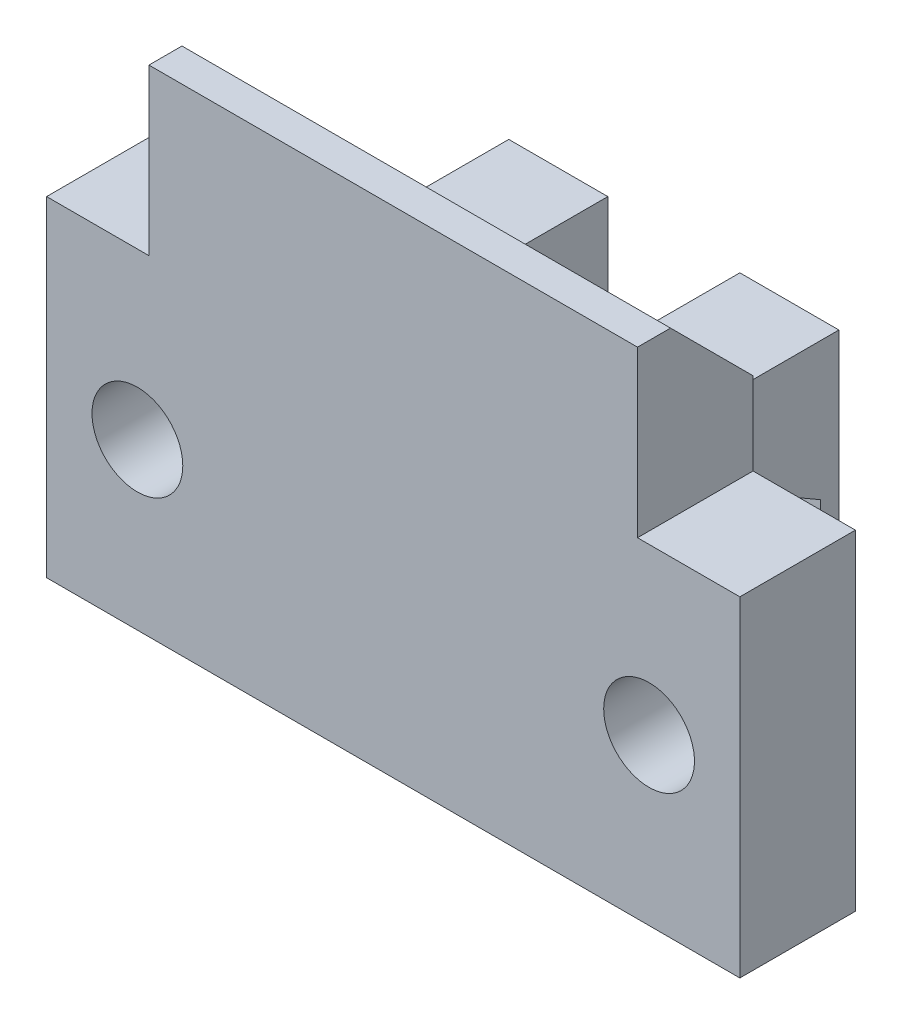
ISO-10303-21;
HEADER;
FILE_DESCRIPTION(('STEP AP214'),'2;1');
FILE_NAME('part.step','',(''),(''),'','','');
FILE_SCHEMA(('AUTOMOTIVE_DESIGN { 1 0 10303 214 1 1 1 1 }'));
ENDSEC;
DATA;
#1=APPLICATION_CONTEXT('core data for automotive mechanical design processes');
#2=APPLICATION_PROTOCOL_DEFINITION('international standard','automotive_design',2000,#1);
#3=PRODUCT_CONTEXT('',#1,'mechanical');
#4=PRODUCT('Part','Part','',(#3));
#5=PRODUCT_RELATED_PRODUCT_CATEGORY('part','',(#4));
#6=PRODUCT_DEFINITION_FORMATION('','',#4);
#7=PRODUCT_DEFINITION_CONTEXT('part definition',#1,'design');
#8=PRODUCT_DEFINITION('design','',#6,#7);
#9=PRODUCT_DEFINITION_SHAPE('','',#8);
#10=(LENGTH_UNIT() NAMED_UNIT(*) SI_UNIT(.MILLI.,.METRE.));
#11=(NAMED_UNIT(*) PLANE_ANGLE_UNIT() SI_UNIT($,.RADIAN.));
#12=(NAMED_UNIT(*) SI_UNIT($,.STERADIAN.) SOLID_ANGLE_UNIT());
#13=UNCERTAINTY_MEASURE_WITH_UNIT(LENGTH_MEASURE(1.E-05),#10,'distance_accuracy_value','');
#14=(GEOMETRIC_REPRESENTATION_CONTEXT(3) GLOBAL_UNCERTAINTY_ASSIGNED_CONTEXT((#13)) GLOBAL_UNIT_ASSIGNED_CONTEXT((#10,
#11,#12)) REPRESENTATION_CONTEXT('',''));
#15=CARTESIAN_POINT('',(0.,0.,0.));
#16=DIRECTION('',(0.,0.,1.));
#17=DIRECTION('',(1.,0.,0.));
#18=AXIS2_PLACEMENT_3D('',#15,#16,#17);
#19=CARTESIAN_POINT('',(-21.001,10.,-9.49999999999999));
#20=DIRECTION('',(1.,0.,0.));
#21=DIRECTION('',(0.,0.,-1.));
#22=AXIS2_PLACEMENT_3D('',#19,#20,#21);
#23=CYLINDRICAL_SURFACE('',#22,1.75);
#24=CARTESIAN_POINT('',(4.,10.,-9.49999999999999));
#25=DIRECTION('',(-1.,0.,0.));
#26=DIRECTION('',(0.,0.,1.));
#27=AXIS2_PLACEMENT_3D('',#24,#25,#26);
#28=CIRCLE('',#27,1.75);
#29=CARTESIAN_POINT('',(4.,10.,-7.74999999999999));
#30=VERTEX_POINT('',#29);
#31=EDGE_CURVE('E313',#30,#30,#28,.F.);
#32=ORIENTED_EDGE('',*,*,#31,.F.);
#33=EDGE_LOOP('',(#32));
#34=FACE_BOUND('',#33,.T.);
#35=CARTESIAN_POINT('',(7.,10.,-9.49999999999999));
#36=DIRECTION('',(1.,0.,0.));
#37=DIRECTION('',(0.,0.,-1.));
#38=AXIS2_PLACEMENT_3D('',#35,#36,#37);
#39=CIRCLE('',#38,1.75);
#40=CARTESIAN_POINT('',(7.,10.,-11.25));
#41=VERTEX_POINT('',#40);
#42=EDGE_CURVE('E261',#41,#41,#39,.F.);
#43=ORIENTED_EDGE('',*,*,#42,.F.);
#44=EDGE_LOOP('',(#43));
#45=FACE_BOUND('',#44,.T.);
#46=ADVANCED_FACE('F47',(#34,#45),#23,.F.);
#47=CARTESIAN_POINT('',(21.001,10.,-9.49999999999999));
#48=DIRECTION('',(-1.,0.,0.));
#49=DIRECTION('',(0.,0.,1.));
#50=AXIS2_PLACEMENT_3D('',#47,#48,#49);
#51=CYLINDRICAL_SURFACE('',#50,1.75);
#52=CARTESIAN_POINT('',(-4.,10.,-9.49999999999999));
#53=DIRECTION('',(-1.,0.,0.));
#54=DIRECTION('',(0.,0.,1.));
#55=AXIS2_PLACEMENT_3D('',#52,#53,#54);
#56=CIRCLE('',#55,1.75);
#57=CARTESIAN_POINT('',(-4.,10.,-7.74999999999999));
#58=VERTEX_POINT('',#57);
#59=EDGE_CURVE('E283',#58,#58,#56,.F.);
#60=ORIENTED_EDGE('',*,*,#59,.T.);
#61=EDGE_LOOP('',(#60));
#62=FACE_BOUND('',#61,.T.);
#63=CARTESIAN_POINT('',(-7.,10.,-9.49999999999999));
#64=DIRECTION('',(-1.,0.,0.));
#65=DIRECTION('',(0.,0.,1.));
#66=AXIS2_PLACEMENT_3D('',#63,#64,#65);
#67=CIRCLE('',#66,1.75);
#68=CARTESIAN_POINT('',(-7.,10.,-7.74999999999999));
#69=VERTEX_POINT('',#68);
#70=EDGE_CURVE('E272',#69,#69,#67,.F.);
#71=ORIENTED_EDGE('',*,*,#70,.F.);
#72=EDGE_LOOP('',(#71));
#73=FACE_BOUND('',#72,.T.);
#74=ADVANCED_FACE('F497',(#62,#73),#51,.F.);
#75=CARTESIAN_POINT('',(0.,20.,0.));
#76=DIRECTION('',(0.,1.,0.));
#77=DIRECTION('',(0.,0.,1.));
#78=AXIS2_PLACEMENT_3D('',#75,#76,#77);
#79=PLANE('',#78);
#80=DIRECTION('',(-1.,0.,0.));
#81=VECTOR('',#80,1.);
#82=CARTESIAN_POINT('',(-14.8,20.,-3.5));
#83=LINE('',#82,#81);
#84=CARTESIAN_POINT('',(10.,20.,-3.5));
#85=VERTEX_POINT('',#84);
#86=CARTESIAN_POINT('',(4.,20.,-3.5));
#87=VERTEX_POINT('',#86);
#88=EDGE_CURVE('E305',#85,#87,#83,.T.);
#89=ORIENTED_EDGE('',*,*,#88,.F.);
#90=DIRECTION('',(0.,0.,-1.));
#91=VECTOR('',#90,1.);
#92=CARTESIAN_POINT('',(10.,20.,-3.49999999999999));
#93=LINE('',#92,#91);
#94=CARTESIAN_POINT('',(10.,20.,-13.5));
#95=VERTEX_POINT('',#94);
#96=EDGE_CURVE('E416',#85,#95,#93,.T.);
#97=ORIENTED_EDGE('',*,*,#96,.T.);
#98=DIRECTION('',(-1.,0.,0.));
#99=VECTOR('',#98,1.);
#100=CARTESIAN_POINT('',(10.,20.,-13.5));
#101=LINE('',#100,#99);
#102=CARTESIAN_POINT('',(4.,20.,-13.5));
#103=VERTEX_POINT('',#102);
#104=EDGE_CURVE('E412',#95,#103,#101,.T.);
#105=ORIENTED_EDGE('',*,*,#104,.T.);
#106=DIRECTION('',(0.,0.,-1.));
#107=VECTOR('',#106,1.);
#108=CARTESIAN_POINT('',(4.,20.,-3.49999999999999));
#109=LINE('',#108,#107);
#110=EDGE_CURVE('E408',#87,#103,#109,.T.);
#111=ORIENTED_EDGE('',*,*,#110,.F.);
#112=EDGE_LOOP('',(#89,#97,#105,#111));
#113=FACE_BOUND('',#112,.T.);
#114=ADVANCED_FACE('F503',(#113),#79,.T.);
#115=DIRECTION('',(-1.,0.,0.));
#116=VECTOR('',#115,1.);
#117=CARTESIAN_POINT('',(0.,20.,-3.5));
#118=LINE('',#117,#116);
#119=CARTESIAN_POINT('',(21.,20.,-3.5));
#120=VERTEX_POINT('',#119);
#121=CARTESIAN_POINT('',(14.8,20.,-3.5));
#122=VERTEX_POINT('',#121);
#123=EDGE_CURVE('E350',#120,#122,#118,.T.);
#124=ORIENTED_EDGE('',*,*,#123,.T.);
#125=DIRECTION('',(0.,0.,1.));
#126=VECTOR('',#125,1.);
#127=CARTESIAN_POINT('',(14.8,20.,-34.7435593362856));
#128=LINE('',#127,#126);
#129=CARTESIAN_POINT('',(14.8,20.,3.5));
#130=VERTEX_POINT('',#129);
#131=EDGE_CURVE('E300',#122,#130,#128,.T.);
#132=ORIENTED_EDGE('',*,*,#131,.T.);
#133=DIRECTION('',(-1.,0.,0.));
#134=VECTOR('',#133,1.);
#135=CARTESIAN_POINT('',(0.,20.,3.5));
#136=LINE('',#135,#134);
#137=CARTESIAN_POINT('',(21.,20.,3.5));
#138=VERTEX_POINT('',#137);
#139=EDGE_CURVE('E345',#138,#130,#136,.T.);
#140=ORIENTED_EDGE('',*,*,#139,.F.);
#141=DIRECTION('',(0.,0.,-1.));
#142=VECTOR('',#141,1.);
#143=CARTESIAN_POINT('',(21.,20.,0.));
#144=LINE('',#143,#142);
#145=EDGE_CURVE('E348',#138,#120,#144,.T.);
#146=ORIENTED_EDGE('',*,*,#145,.T.);
#147=EDGE_LOOP('',(#124,#132,#140,#146));
#148=FACE_BOUND('',#147,.T.);
#149=ADVANCED_FACE('F480',(#148),#79,.T.);
#150=CARTESIAN_POINT('',(-4.,20.,-3.5));
#151=VERTEX_POINT('',#150);
#152=CARTESIAN_POINT('',(-10.,20.,-3.5));
#153=VERTEX_POINT('',#152);
#154=EDGE_CURVE('E310',#151,#153,#83,.T.);
#155=ORIENTED_EDGE('',*,*,#154,.F.);
#156=DIRECTION('',(0.,0.,-1.));
#157=VECTOR('',#156,1.);
#158=CARTESIAN_POINT('',(-4.,20.,0.));
#159=LINE('',#158,#157);
#160=CARTESIAN_POINT('',(-4.,20.,-13.5));
#161=VERTEX_POINT('',#160);
#162=EDGE_CURVE('E353',#151,#161,#159,.T.);
#163=ORIENTED_EDGE('',*,*,#162,.T.);
#164=DIRECTION('',(1.,0.,0.));
#165=VECTOR('',#164,1.);
#166=CARTESIAN_POINT('',(0.,20.,-13.5));
#167=LINE('',#166,#165);
#168=CARTESIAN_POINT('',(-10.,20.,-13.5));
#169=VERTEX_POINT('',#168);
#170=EDGE_CURVE('E356',#169,#161,#167,.T.);
#171=ORIENTED_EDGE('',*,*,#170,.F.);
#172=DIRECTION('',(0.,0.,-1.));
#173=VECTOR('',#172,1.);
#174=CARTESIAN_POINT('',(-10.,20.,0.));
#175=LINE('',#174,#173);
#176=EDGE_CURVE('E359',#153,#169,#175,.T.);
#177=ORIENTED_EDGE('',*,*,#176,.F.);
#178=EDGE_LOOP('',(#155,#163,#171,#177));
#179=FACE_BOUND('',#178,.T.);
#180=ADVANCED_FACE('F535',(#179),#79,.T.);
#181=CARTESIAN_POINT('',(-15.5,10.,3.5));
#182=DIRECTION('',(0.,0.,-1.));
#183=DIRECTION('',(-1.,0.,0.));
#184=AXIS2_PLACEMENT_3D('',#181,#182,#183);
#185=CYLINDRICAL_SURFACE('',#184,2.75);
#186=CARTESIAN_POINT('',(-15.5,10.,3.5));
#187=DIRECTION('',(0.,0.,-1.));
#188=DIRECTION('',(1.,0.,0.));
#189=AXIS2_PLACEMENT_3D('',#186,#187,#188);
#190=CIRCLE('',#189,2.75);
#191=CARTESIAN_POINT('',(-12.75,10.,3.5));
#192=VERTEX_POINT('',#191);
#193=EDGE_CURVE('E335',#192,#192,#190,.T.);
#194=ORIENTED_EDGE('',*,*,#193,.F.);
#195=EDGE_LOOP('',(#194));
#196=FACE_BOUND('',#195,.T.);
#197=CARTESIAN_POINT('',(-15.5,10.,-1.5));
#198=DIRECTION('',(0.,0.,-1.));
#199=DIRECTION('',(-1.,0.,0.));
#200=AXIS2_PLACEMENT_3D('',#197,#198,#199);
#201=CIRCLE('',#200,2.75);
#202=CARTESIAN_POINT('',(-18.25,10.,-1.5));
#203=VERTEX_POINT('',#202);
#204=EDGE_CURVE('E339',#203,#203,#201,.F.);
#205=ORIENTED_EDGE('',*,*,#204,.F.);
#206=EDGE_LOOP('',(#205));
#207=FACE_BOUND('',#206,.T.);
#208=ADVANCED_FACE('F530',(#196,#207),#185,.F.);
#209=CARTESIAN_POINT('',(15.5,10.,3.5));
#210=DIRECTION('',(0.,0.,-1.));
#211=DIRECTION('',(-1.,0.,0.));
#212=AXIS2_PLACEMENT_3D('',#209,#210,#211);
#213=CYLINDRICAL_SURFACE('',#212,2.75);
#214=CARTESIAN_POINT('',(15.5,10.,3.5));
#215=DIRECTION('',(0.,0.,-1.));
#216=DIRECTION('',(-1.,0.,0.));
#217=AXIS2_PLACEMENT_3D('',#214,#215,#216);
#218=CIRCLE('',#217,2.75);
#219=CARTESIAN_POINT('',(12.75,10.,3.5));
#220=VERTEX_POINT('',#219);
#221=EDGE_CURVE('E331',#220,#220,#218,.T.);
#222=ORIENTED_EDGE('',*,*,#221,.F.);
#223=EDGE_LOOP('',(#222));
#224=FACE_BOUND('',#223,.T.);
#225=CARTESIAN_POINT('',(15.5,10.,-1.5));
#226=DIRECTION('',(0.,0.,-1.));
#227=DIRECTION('',(-1.,0.,0.));
#228=AXIS2_PLACEMENT_3D('',#225,#226,#227);
#229=CIRCLE('',#228,2.75);
#230=CARTESIAN_POINT('',(12.75,10.,-1.5));
#231=VERTEX_POINT('',#230);
#232=EDGE_CURVE('E320',#231,#231,#229,.F.);
#233=ORIENTED_EDGE('',*,*,#232,.F.);
#234=EDGE_LOOP('',(#233));
#235=FACE_BOUND('',#234,.T.);
#236=ADVANCED_FACE('F527',(#224,#235),#213,.F.);
#237=CARTESIAN_POINT('',(-21.,20.,0.));
#238=DIRECTION('',(-1.,0.,0.));
#239=DIRECTION('',(0.,0.,1.));
#240=AXIS2_PLACEMENT_3D('',#237,#238,#239);
#241=PLANE('',#240);
#242=DIRECTION('',(0.,0.,-1.));
#243=VECTOR('',#242,1.);
#244=CARTESIAN_POINT('',(-21.,0.,0.));
#245=LINE('',#244,#243);
#246=CARTESIAN_POINT('',(-21.,0.,3.5));
#247=VERTEX_POINT('',#246);
#248=CARTESIAN_POINT('',(-21.,0.,-3.5));
#249=VERTEX_POINT('',#248);
#250=EDGE_CURVE('E363',#247,#249,#245,.T.);
#251=ORIENTED_EDGE('',*,*,#250,.F.);
#252=DIRECTION('',(0.,-1.,0.));
#253=VECTOR('',#252,1.);
#254=CARTESIAN_POINT('',(-21.,20.,3.5));
#255=LINE('',#254,#253);
#256=CARTESIAN_POINT('',(-21.,20.,3.5));
#257=VERTEX_POINT('',#256);
#258=EDGE_CURVE('E402',#257,#247,#255,.T.);
#259=ORIENTED_EDGE('',*,*,#258,.F.);
#260=DIRECTION('',(0.,0.,-1.));
#261=VECTOR('',#260,1.);
#262=CARTESIAN_POINT('',(-21.,20.,0.));
#263=LINE('',#262,#261);
#264=CARTESIAN_POINT('',(-21.,20.,-3.5));
#265=VERTEX_POINT('',#264);
#266=EDGE_CURVE('E340',#257,#265,#263,.T.);
#267=ORIENTED_EDGE('',*,*,#266,.T.);
#268=DIRECTION('',(0.,-1.,0.));
#269=VECTOR('',#268,1.);
#270=CARTESIAN_POINT('',(-21.,20.,-3.5));
#271=LINE('',#270,#269);
#272=EDGE_CURVE('E385',#265,#249,#271,.T.);
#273=ORIENTED_EDGE('',*,*,#272,.T.);
#274=EDGE_LOOP('',(#251,#259,#267,#273));
#275=FACE_BOUND('',#274,.T.);
#276=ADVANCED_FACE('F457',(#275),#241,.T.);
#277=CARTESIAN_POINT('',(0.,20.,3.5));
#278=DIRECTION('',(0.,0.,1.));
#279=DIRECTION('',(1.,0.,0.));
#280=AXIS2_PLACEMENT_3D('',#277,#278,#279);
#281=PLANE('',#280);
#282=ORIENTED_EDGE('',*,*,#221,.T.);
#283=EDGE_LOOP('',(#282));
#284=FACE_BOUND('',#283,.T.);
#285=ORIENTED_EDGE('',*,*,#193,.T.);
#286=EDGE_LOOP('',(#285));
#287=FACE_BOUND('',#286,.T.);
#288=DIRECTION('',(-1.,0.,0.));
#289=VECTOR('',#288,1.);
#290=CARTESIAN_POINT('',(0.,0.,3.5));
#291=LINE('',#290,#289);
#292=CARTESIAN_POINT('',(21.,0.,3.5));
#293=VERTEX_POINT('',#292);
#294=EDGE_CURVE('E366',#293,#247,#291,.T.);
#295=ORIENTED_EDGE('',*,*,#294,.F.);
#296=DIRECTION('',(0.,-1.,0.));
#297=VECTOR('',#296,1.);
#298=CARTESIAN_POINT('',(21.,20.,3.5));
#299=LINE('',#298,#297);
#300=EDGE_CURVE('E400',#138,#293,#299,.T.);
#301=ORIENTED_EDGE('',*,*,#300,.F.);
#302=ORIENTED_EDGE('',*,*,#139,.T.);
#303=DIRECTION('',(0.,1.,0.));
#304=VECTOR('',#303,1.);
#305=CARTESIAN_POINT('',(14.8,30.,3.5));
#306=LINE('',#305,#304);
#307=CARTESIAN_POINT('',(14.8,30.,3.5));
#308=VERTEX_POINT('',#307);
#309=EDGE_CURVE('E288',#130,#308,#306,.T.);
#310=ORIENTED_EDGE('',*,*,#309,.T.);
#311=DIRECTION('',(-1.,0.,0.));
#312=VECTOR('',#311,1.);
#313=CARTESIAN_POINT('',(-14.8,30.,3.5));
#314=LINE('',#313,#312);
#315=CARTESIAN_POINT('',(-14.8,30.,3.5));
#316=VERTEX_POINT('',#315);
#317=EDGE_CURVE('E291',#308,#316,#314,.T.);
#318=ORIENTED_EDGE('',*,*,#317,.T.);
#319=DIRECTION('',(0.,-1.,0.));
#320=VECTOR('',#319,1.);
#321=CARTESIAN_POINT('',(-14.8,30.,3.5));
#322=LINE('',#321,#320);
#323=CARTESIAN_POINT('',(-14.8,20.,3.5));
#324=VERTEX_POINT('',#323);
#325=EDGE_CURVE('E284',#316,#324,#322,.T.);
#326=ORIENTED_EDGE('',*,*,#325,.T.);
#327=EDGE_CURVE('E343',#324,#257,#136,.T.);
#328=ORIENTED_EDGE('',*,*,#327,.T.);
#329=ORIENTED_EDGE('',*,*,#258,.T.);
#330=EDGE_LOOP('',(#295,#301,#302,#310,#318,#326,#328,#329));
#331=FACE_BOUND('',#330,.T.);
#332=ADVANCED_FACE('F451',(#284,#287,#331),#281,.T.);
#333=CARTESIAN_POINT('',(21.,20.,0.));
#334=DIRECTION('',(-1.,0.,0.));
#335=DIRECTION('',(0.,0.,1.));
#336=AXIS2_PLACEMENT_3D('',#333,#334,#335);
#337=PLANE('',#336);
#338=DIRECTION('',(0.,0.,-1.));
#339=VECTOR('',#338,1.);
#340=CARTESIAN_POINT('',(21.,0.,0.));
#341=LINE('',#340,#339);
#342=CARTESIAN_POINT('',(21.,0.,-3.5));
#343=VERTEX_POINT('',#342);
#344=EDGE_CURVE('E370',#293,#343,#341,.T.);
#345=ORIENTED_EDGE('',*,*,#344,.T.);
#346=DIRECTION('',(0.,-1.,0.));
#347=VECTOR('',#346,1.);
#348=CARTESIAN_POINT('',(21.,20.,-3.5));
#349=LINE('',#348,#347);
#350=EDGE_CURVE('E397',#120,#343,#349,.T.);
#351=ORIENTED_EDGE('',*,*,#350,.F.);
#352=ORIENTED_EDGE('',*,*,#145,.F.);
#353=ORIENTED_EDGE('',*,*,#300,.T.);
#354=EDGE_LOOP('',(#345,#351,#352,#353));
#355=FACE_BOUND('',#354,.T.);
#356=ADVANCED_FACE('F477',(#355),#337,.F.);
#357=CARTESIAN_POINT('',(-4.,20.,0.));
#358=DIRECTION('',(-1.,0.,0.));
#359=DIRECTION('',(0.,0.,1.));
#360=AXIS2_PLACEMENT_3D('',#357,#358,#359);
#361=PLANE('',#360);
#362=ORIENTED_EDGE('',*,*,#59,.F.);
#363=EDGE_LOOP('',(#362));
#364=FACE_BOUND('',#363,.T.);
#365=DIRECTION('',(0.,0.,-1.));
#366=VECTOR('',#365,1.);
#367=CARTESIAN_POINT('',(-4.,0.,0.));
#368=LINE('',#367,#366);
#369=CARTESIAN_POINT('',(-4.,0.,-3.5));
#370=VERTEX_POINT('',#369);
#371=CARTESIAN_POINT('',(-4.,0.,-13.5));
#372=VERTEX_POINT('',#371);
#373=EDGE_CURVE('E376',#370,#372,#368,.T.);
#374=ORIENTED_EDGE('',*,*,#373,.T.);
#375=DIRECTION('',(0.,-1.,0.));
#376=VECTOR('',#375,1.);
#377=CARTESIAN_POINT('',(-4.,20.,-13.5));
#378=LINE('',#377,#376);
#379=EDGE_CURVE('E392',#161,#372,#378,.T.);
#380=ORIENTED_EDGE('',*,*,#379,.F.);
#381=ORIENTED_EDGE('',*,*,#162,.F.);
#382=DIRECTION('',(0.,-1.,0.));
#383=VECTOR('',#382,1.);
#384=CARTESIAN_POINT('',(-4.,20.,-3.5));
#385=LINE('',#384,#383);
#386=EDGE_CURVE('E394',#151,#370,#385,.T.);
#387=ORIENTED_EDGE('',*,*,#386,.T.);
#388=EDGE_LOOP('',(#374,#380,#381,#387));
#389=FACE_BOUND('',#388,.T.);
#390=ADVANCED_FACE('F551',(#364,#389),#361,.F.);
#391=CARTESIAN_POINT('',(0.,20.,-13.5));
#392=DIRECTION('',(0.,0.,-1.));
#393=DIRECTION('',(-1.,0.,0.));
#394=AXIS2_PLACEMENT_3D('',#391,#392,#393);
#395=PLANE('',#394);
#396=DIRECTION('',(1.,0.,0.));
#397=VECTOR('',#396,1.);
#398=CARTESIAN_POINT('',(0.,0.,-13.5));
#399=LINE('',#398,#397);
#400=CARTESIAN_POINT('',(-10.,0.,-13.5));
#401=VERTEX_POINT('',#400);
#402=EDGE_CURVE('E379',#401,#372,#399,.T.);
#403=ORIENTED_EDGE('',*,*,#402,.F.);
#404=DIRECTION('',(0.,-1.,0.));
#405=VECTOR('',#404,1.);
#406=CARTESIAN_POINT('',(-10.,20.,-13.5));
#407=LINE('',#406,#405);
#408=EDGE_CURVE('E390',#169,#401,#407,.T.);
#409=ORIENTED_EDGE('',*,*,#408,.F.);
#410=ORIENTED_EDGE('',*,*,#170,.T.);
#411=ORIENTED_EDGE('',*,*,#379,.T.);
#412=EDGE_LOOP('',(#403,#409,#410,#411));
#413=FACE_BOUND('',#412,.T.);
#414=ADVANCED_FACE('F547',(#413),#395,.T.);
#415=CARTESIAN_POINT('',(-10.,20.,0.));
#416=DIRECTION('',(-1.,0.,0.));
#417=DIRECTION('',(0.,0.,1.));
#418=AXIS2_PLACEMENT_3D('',#415,#416,#417);
#419=PLANE('',#418);
#420=CARTESIAN_POINT('',(-10.,10.,-9.49999999999999));
#421=DIRECTION('',(-1.,0.,0.));
#422=DIRECTION('',(0.,0.,1.));
#423=AXIS2_PLACEMENT_3D('',#420,#421,#422);
#424=CIRCLE('',#423,2.9);
#425=CARTESIAN_POINT('',(-10.,10.,-6.59999999999999));
#426=VERTEX_POINT('',#425);
#427=EDGE_CURVE('E273',#426,#426,#424,.T.);
#428=ORIENTED_EDGE('',*,*,#427,.F.);
#429=EDGE_LOOP('',(#428));
#430=FACE_BOUND('',#429,.T.);
#431=DIRECTION('',(0.,0.,-1.));
#432=VECTOR('',#431,1.);
#433=CARTESIAN_POINT('',(-10.,0.,0.));
#434=LINE('',#433,#432);
#435=CARTESIAN_POINT('',(-10.,0.,-3.5));
#436=VERTEX_POINT('',#435);
#437=EDGE_CURVE('E382',#436,#401,#434,.T.);
#438=ORIENTED_EDGE('',*,*,#437,.F.);
#439=DIRECTION('',(0.,-1.,0.));
#440=VECTOR('',#439,1.);
#441=CARTESIAN_POINT('',(-10.,20.,-3.5));
#442=LINE('',#441,#440);
#443=EDGE_CURVE('E387',#153,#436,#442,.T.);
#444=ORIENTED_EDGE('',*,*,#443,.F.);
#445=ORIENTED_EDGE('',*,*,#176,.T.);
#446=ORIENTED_EDGE('',*,*,#408,.T.);
#447=EDGE_LOOP('',(#438,#444,#445,#446));
#448=FACE_BOUND('',#447,.T.);
#449=ADVANCED_FACE('F543',(#430,#448),#419,.T.);
#450=CARTESIAN_POINT('',(0.,20.,-3.5));
#451=DIRECTION('',(0.,0.,1.));
#452=DIRECTION('',(1.,0.,0.));
#453=AXIS2_PLACEMENT_3D('',#450,#451,#452);
#454=PLANE('',#453);
#455=CARTESIAN_POINT('',(-15.5,10.,-3.5));
#456=DIRECTION('',(0.,0.,-1.));
#457=DIRECTION('',(-1.,0.,0.));
#458=AXIS2_PLACEMENT_3D('',#455,#456,#457);
#459=CIRCLE('',#458,4.5);
#460=CARTESIAN_POINT('',(-20.,10.,-3.5));
#461=VERTEX_POINT('',#460);
#462=EDGE_CURVE('E316',#461,#461,#459,.T.);
#463=ORIENTED_EDGE('',*,*,#462,.F.);
#464=EDGE_LOOP('',(#463));
#465=FACE_BOUND('',#464,.T.);
#466=DIRECTION('',(0.,1.,0.));
#467=VECTOR('',#466,1.);
#468=CARTESIAN_POINT('',(-14.8,30.,-3.5));
#469=LINE('',#468,#467);
#470=CARTESIAN_POINT('',(-14.8,20.,-3.5));
#471=VERTEX_POINT('',#470);
#472=CARTESIAN_POINT('',(-14.8,25.,-3.5));
#473=VERTEX_POINT('',#472);
#474=EDGE_CURVE('E278',#471,#473,#469,.T.);
#475=ORIENTED_EDGE('',*,*,#474,.T.);
#476=DIRECTION('',(1.,0.,0.));
#477=VECTOR('',#476,1.);
#478=CARTESIAN_POINT('',(14.8,25.,-3.5));
#479=LINE('',#478,#477);
#480=CARTESIAN_POINT('',(14.8,25.,-3.5));
#481=VERTEX_POINT('',#480);
#482=EDGE_CURVE('E309',#473,#481,#479,.T.);
#483=ORIENTED_EDGE('',*,*,#482,.T.);
#484=DIRECTION('',(0.,-1.,0.));
#485=VECTOR('',#484,1.);
#486=CARTESIAN_POINT('',(14.8,30.,-3.5));
#487=LINE('',#486,#485);
#488=EDGE_CURVE('E276',#481,#122,#487,.T.);
#489=ORIENTED_EDGE('',*,*,#488,.T.);
#490=ORIENTED_EDGE('',*,*,#123,.F.);
#491=ORIENTED_EDGE('',*,*,#350,.T.);
#492=DIRECTION('',(-1.,0.,0.));
#493=VECTOR('',#492,1.);
#494=CARTESIAN_POINT('',(0.,0.,-3.5));
#495=LINE('',#494,#493);
#496=CARTESIAN_POINT('',(10.,0.,-3.5));
#497=VERTEX_POINT('',#496);
#498=EDGE_CURVE('E373',#343,#497,#495,.T.);
#499=ORIENTED_EDGE('',*,*,#498,.T.);
#500=DIRECTION('',(0.,-1.,0.));
#501=VECTOR('',#500,1.);
#502=CARTESIAN_POINT('',(10.,20.,-3.5));
#503=LINE('',#502,#501);
#504=EDGE_CURVE('E406',#85,#497,#503,.T.);
#505=ORIENTED_EDGE('',*,*,#504,.F.);
#506=ORIENTED_EDGE('',*,*,#88,.T.);
#507=DIRECTION('',(0.,-1.,0.));
#508=VECTOR('',#507,1.);
#509=CARTESIAN_POINT('',(4.,20.,-3.5));
#510=LINE('',#509,#508);
#511=CARTESIAN_POINT('',(4.,0.,-3.5));
#512=VERTEX_POINT('',#511);
#513=EDGE_CURVE('E404',#87,#512,#510,.T.);
#514=ORIENTED_EDGE('',*,*,#513,.T.);
#515=EDGE_CURVE('E372',#512,#370,#495,.T.);
#516=ORIENTED_EDGE('',*,*,#515,.T.);
#517=ORIENTED_EDGE('',*,*,#386,.F.);
#518=ORIENTED_EDGE('',*,*,#154,.T.);
#519=ORIENTED_EDGE('',*,*,#443,.T.);
#520=EDGE_CURVE('E344',#436,#249,#495,.T.);
#521=ORIENTED_EDGE('',*,*,#520,.T.);
#522=ORIENTED_EDGE('',*,*,#272,.F.);
#523=EDGE_CURVE('E354',#471,#265,#118,.T.);
#524=ORIENTED_EDGE('',*,*,#523,.F.);
#525=EDGE_LOOP('',(#475,#483,#489,#490,#491,#499,#505,#506,#514,#516,#517,#518,#519,#521,#522,#524));
#526=FACE_BOUND('',#525,.T.);
#527=CARTESIAN_POINT('',(15.5,10.,-3.5));
#528=DIRECTION('',(0.,0.,-1.));
#529=DIRECTION('',(-1.,0.,0.));
#530=AXIS2_PLACEMENT_3D('',#527,#528,#529);
#531=CIRCLE('',#530,4.5);
#532=CARTESIAN_POINT('',(11.,10.,-3.5));
#533=VERTEX_POINT('',#532);
#534=EDGE_CURVE('E321',#533,#533,#531,.T.);
#535=ORIENTED_EDGE('',*,*,#534,.F.);
#536=EDGE_LOOP('',(#535));
#537=FACE_BOUND('',#536,.T.);
#538=ADVANCED_FACE('F464',(#465,#526,#537),#454,.F.);
#539=DIRECTION('',(0.,0.,1.));
#540=VECTOR('',#539,1.);
#541=CARTESIAN_POINT('',(-14.8,20.,-34.7435593362856));
#542=LINE('',#541,#540);
#543=EDGE_CURVE('E295',#471,#324,#542,.T.);
#544=ORIENTED_EDGE('',*,*,#543,.F.);
#545=ORIENTED_EDGE('',*,*,#523,.T.);
#546=ORIENTED_EDGE('',*,*,#266,.F.);
#547=ORIENTED_EDGE('',*,*,#327,.F.);
#548=EDGE_LOOP('',(#544,#545,#546,#547));
#549=FACE_BOUND('',#548,.T.);
#550=ADVANCED_FACE('F458',(#549),#79,.T.);
#551=CARTESIAN_POINT('',(0.,0.,0.));
#552=DIRECTION('',(0.,1.,0.));
#553=DIRECTION('',(0.,0.,1.));
#554=AXIS2_PLACEMENT_3D('',#551,#552,#553);
#555=PLANE('',#554);
#556=ORIENTED_EDGE('',*,*,#250,.T.);
#557=ORIENTED_EDGE('',*,*,#520,.F.);
#558=ORIENTED_EDGE('',*,*,#437,.T.);
#559=ORIENTED_EDGE('',*,*,#402,.T.);
#560=ORIENTED_EDGE('',*,*,#373,.F.);
#561=ORIENTED_EDGE('',*,*,#515,.F.);
#562=DIRECTION('',(0.,0.,-1.));
#563=VECTOR('',#562,1.);
#564=CARTESIAN_POINT('',(4.,0.,-3.49999999999999));
#565=LINE('',#564,#563);
#566=CARTESIAN_POINT('',(4.,0.,-13.5));
#567=VERTEX_POINT('',#566);
#568=EDGE_CURVE('E334',#512,#567,#565,.T.);
#569=ORIENTED_EDGE('',*,*,#568,.T.);
#570=DIRECTION('',(-1.,0.,0.));
#571=VECTOR('',#570,1.);
#572=CARTESIAN_POINT('',(10.,0.,-13.5));
#573=LINE('',#572,#571);
#574=CARTESIAN_POINT('',(10.,0.,-13.5));
#575=VERTEX_POINT('',#574);
#576=EDGE_CURVE('E422',#575,#567,#573,.T.);
#577=ORIENTED_EDGE('',*,*,#576,.F.);
#578=DIRECTION('',(0.,0.,-1.));
#579=VECTOR('',#578,1.);
#580=CARTESIAN_POINT('',(10.,0.,-3.49999999999999));
#581=LINE('',#580,#579);
#582=EDGE_CURVE('E413',#497,#575,#581,.T.);
#583=ORIENTED_EDGE('',*,*,#582,.F.);
#584=ORIENTED_EDGE('',*,*,#498,.F.);
#585=ORIENTED_EDGE('',*,*,#344,.F.);
#586=ORIENTED_EDGE('',*,*,#294,.T.);
#587=EDGE_LOOP('',(#556,#557,#558,#559,#560,#561,#569,#577,#583,#584,#585,#586));
#588=FACE_BOUND('',#587,.T.);
#589=ADVANCED_FACE('F469',(#588),#555,.F.);
#590=CARTESIAN_POINT('',(10.,20.,-3.49999999999999));
#591=DIRECTION('',(-1.,0.,0.));
#592=DIRECTION('',(0.,0.,1.));
#593=AXIS2_PLACEMENT_3D('',#590,#591,#592);
#594=PLANE('',#593);
#595=DIRECTION('',(0.,-0.5,0.866025403784439));
#596=VECTOR('',#595,1.);
#597=CARTESIAN_POINT('',(10.,13.3197640478403,-9.49999999999999));
#598=LINE('',#597,#596);
#599=CARTESIAN_POINT('',(10.,13.3197640478403,-9.49999999999999));
#600=VERTEX_POINT('',#599);
#601=CARTESIAN_POINT('',(10.,11.6598820239202,-6.62499999999999));
#602=VERTEX_POINT('',#601);
#603=EDGE_CURVE('E249',#600,#602,#598,.T.);
#604=ORIENTED_EDGE('',*,*,#603,.F.);
#605=DIRECTION('',(0.,0.5,0.866025403784439));
#606=VECTOR('',#605,1.);
#607=CARTESIAN_POINT('',(10.,11.6598820239202,-12.375));
#608=LINE('',#607,#606);
#609=CARTESIAN_POINT('',(10.,11.6598820239202,-12.375));
#610=VERTEX_POINT('',#609);
#611=EDGE_CURVE('E216',#610,#600,#608,.T.);
#612=ORIENTED_EDGE('',*,*,#611,.F.);
#613=DIRECTION('',(0.,1.,0.));
#614=VECTOR('',#613,1.);
#615=CARTESIAN_POINT('',(10.,8.34011797607983,-12.375));
#616=LINE('',#615,#614);
#617=CARTESIAN_POINT('',(10.,8.34011797607983,-12.375));
#618=VERTEX_POINT('',#617);
#619=EDGE_CURVE('E235',#618,#610,#616,.T.);
#620=ORIENTED_EDGE('',*,*,#619,.F.);
#621=DIRECTION('',(0.,0.5,-0.866025403784438));
#622=VECTOR('',#621,1.);
#623=CARTESIAN_POINT('',(10.,6.68023595215965,-9.49999999999999));
#624=LINE('',#623,#622);
#625=CARTESIAN_POINT('',(10.,6.68023595215965,-9.49999999999999));
#626=VERTEX_POINT('',#625);
#627=EDGE_CURVE('E238',#626,#618,#624,.T.);
#628=ORIENTED_EDGE('',*,*,#627,.F.);
#629=DIRECTION('',(0.,-0.5,-0.866025403784439));
#630=VECTOR('',#629,1.);
#631=CARTESIAN_POINT('',(10.,8.34011797607983,-6.62499999999999));
#632=LINE('',#631,#630);
#633=CARTESIAN_POINT('',(10.,8.34011797607983,-6.62499999999999));
#634=VERTEX_POINT('',#633);
#635=EDGE_CURVE('E254',#634,#626,#632,.T.);
#636=ORIENTED_EDGE('',*,*,#635,.F.);
#637=DIRECTION('',(0.,-1.,0.));
#638=VECTOR('',#637,1.);
#639=CARTESIAN_POINT('',(10.,11.6598820239202,-6.62499999999999));
#640=LINE('',#639,#638);
#641=EDGE_CURVE('E251',#602,#634,#640,.T.);
#642=ORIENTED_EDGE('',*,*,#641,.F.);
#643=EDGE_LOOP('',(#604,#612,#620,#628,#636,#642));
#644=FACE_BOUND('',#643,.T.);
#645=ORIENTED_EDGE('',*,*,#582,.T.);
#646=DIRECTION('',(0.,-1.,0.));
#647=VECTOR('',#646,1.);
#648=CARTESIAN_POINT('',(10.,20.,-13.5));
#649=LINE('',#648,#647);
#650=EDGE_CURVE('E367',#95,#575,#649,.T.);
#651=ORIENTED_EDGE('',*,*,#650,.F.);
#652=ORIENTED_EDGE('',*,*,#96,.F.);
#653=ORIENTED_EDGE('',*,*,#504,.T.);
#654=EDGE_LOOP('',(#645,#651,#652,#653));
#655=FACE_BOUND('',#654,.T.);
#656=ADVANCED_FACE('F532',(#644,#655),#594,.F.);
#657=CARTESIAN_POINT('',(10.,20.,-13.5));
#658=DIRECTION('',(0.,0.,1.));
#659=DIRECTION('',(1.,0.,0.));
#660=AXIS2_PLACEMENT_3D('',#657,#658,#659);
#661=PLANE('',#660);
#662=ORIENTED_EDGE('',*,*,#576,.T.);
#663=DIRECTION('',(0.,-1.,0.));
#664=VECTOR('',#663,1.);
#665=CARTESIAN_POINT('',(4.,20.,-13.5));
#666=LINE('',#665,#664);
#667=EDGE_CURVE('E419',#103,#567,#666,.T.);
#668=ORIENTED_EDGE('',*,*,#667,.F.);
#669=ORIENTED_EDGE('',*,*,#104,.F.);
#670=ORIENTED_EDGE('',*,*,#650,.T.);
#671=EDGE_LOOP('',(#662,#668,#669,#670));
#672=FACE_BOUND('',#671,.T.);
#673=ADVANCED_FACE('F565',(#672),#661,.F.);
#674=CARTESIAN_POINT('',(4.,20.,-3.49999999999999));
#675=DIRECTION('',(-1.,0.,0.));
#676=DIRECTION('',(0.,0.,1.));
#677=AXIS2_PLACEMENT_3D('',#674,#675,#676);
#678=PLANE('',#677);
#679=ORIENTED_EDGE('',*,*,#31,.T.);
#680=EDGE_LOOP('',(#679));
#681=FACE_BOUND('',#680,.T.);
#682=ORIENTED_EDGE('',*,*,#568,.F.);
#683=ORIENTED_EDGE('',*,*,#513,.F.);
#684=ORIENTED_EDGE('',*,*,#110,.T.);
#685=ORIENTED_EDGE('',*,*,#667,.T.);
#686=EDGE_LOOP('',(#682,#683,#684,#685));
#687=FACE_BOUND('',#686,.T.);
#688=ADVANCED_FACE('F514',(#681,#687),#678,.T.);
#689=CARTESIAN_POINT('',(15.5,10.,-1.5));
#690=DIRECTION('',(0.,0.,-1.));
#691=DIRECTION('',(-1.,0.,0.));
#692=AXIS2_PLACEMENT_3D('',#689,#690,#691);
#693=PLANE('',#692);
#694=CARTESIAN_POINT('',(15.5,10.,-1.5));
#695=DIRECTION('',(0.,0.,-1.));
#696=DIRECTION('',(-1.,0.,0.));
#697=AXIS2_PLACEMENT_3D('',#694,#695,#696);
#698=CIRCLE('',#697,4.5);
#699=CARTESIAN_POINT('',(11.,10.,-1.5));
#700=VERTEX_POINT('',#699);
#701=EDGE_CURVE('E317',#700,#700,#698,.T.);
#702=ORIENTED_EDGE('',*,*,#701,.T.);
#703=EDGE_LOOP('',(#702));
#704=FACE_BOUND('',#703,.T.);
#705=ORIENTED_EDGE('',*,*,#232,.T.);
#706=EDGE_LOOP('',(#705));
#707=FACE_BOUND('',#706,.T.);
#708=ADVANCED_FACE('F510',(#704,#707),#693,.T.);
#709=CARTESIAN_POINT('',(15.5,10.,-1.5));
#710=DIRECTION('',(0.,0.,-1.));
#711=DIRECTION('',(-1.,0.,0.));
#712=AXIS2_PLACEMENT_3D('',#709,#710,#711);
#713=CYLINDRICAL_SURFACE('',#712,4.5);
#714=ORIENTED_EDGE('',*,*,#701,.F.);
#715=EDGE_LOOP('',(#714));
#716=FACE_BOUND('',#715,.T.);
#717=ORIENTED_EDGE('',*,*,#534,.T.);
#718=EDGE_LOOP('',(#717));
#719=FACE_BOUND('',#718,.T.);
#720=ADVANCED_FACE('F513',(#716,#719),#713,.F.);
#721=CARTESIAN_POINT('',(-15.5,10.,-1.5));
#722=DIRECTION('',(0.,0.,-1.));
#723=DIRECTION('',(-1.,0.,0.));
#724=AXIS2_PLACEMENT_3D('',#721,#722,#723);
#725=PLANE('',#724);
#726=CARTESIAN_POINT('',(-15.5,10.,-1.5));
#727=DIRECTION('',(0.,0.,-1.));
#728=DIRECTION('',(-1.,0.,0.));
#729=AXIS2_PLACEMENT_3D('',#726,#727,#728);
#730=CIRCLE('',#729,4.5);
#731=CARTESIAN_POINT('',(-20.,10.,-1.5));
#732=VERTEX_POINT('',#731);
#733=EDGE_CURVE('E324',#732,#732,#730,.T.);
#734=ORIENTED_EDGE('',*,*,#733,.T.);
#735=EDGE_LOOP('',(#734));
#736=FACE_BOUND('',#735,.T.);
#737=ORIENTED_EDGE('',*,*,#204,.T.);
#738=EDGE_LOOP('',(#737));
#739=FACE_BOUND('',#738,.T.);
#740=ADVANCED_FACE('F518',(#736,#739),#725,.T.);
#741=CARTESIAN_POINT('',(-15.5,10.,-1.5));
#742=DIRECTION('',(0.,0.,-1.));
#743=DIRECTION('',(-1.,0.,0.));
#744=AXIS2_PLACEMENT_3D('',#741,#742,#743);
#745=CYLINDRICAL_SURFACE('',#744,4.5);
#746=ORIENTED_EDGE('',*,*,#733,.F.);
#747=EDGE_LOOP('',(#746));
#748=FACE_BOUND('',#747,.T.);
#749=ORIENTED_EDGE('',*,*,#462,.T.);
#750=EDGE_LOOP('',(#749));
#751=FACE_BOUND('',#750,.T.);
#752=ADVANCED_FACE('F522',(#748,#751),#745,.F.);
#753=CARTESIAN_POINT('',(-14.8,30.,-34.7435593362856));
#754=DIRECTION('',(-1.,0.,0.));
#755=DIRECTION('',(0.,-1.,0.));
#756=AXIS2_PLACEMENT_3D('',#753,#754,#755);
#757=PLANE('',#756);
#758=DIRECTION('',(0.,0.,1.));
#759=VECTOR('',#758,1.);
#760=CARTESIAN_POINT('',(-14.8,30.,-34.7435593362856));
#761=LINE('',#760,#759);
#762=CARTESIAN_POINT('',(-14.8,30.,1.50000000000002));
#763=VERTEX_POINT('',#762);
#764=EDGE_CURVE('E279',#763,#316,#761,.T.);
#765=ORIENTED_EDGE('',*,*,#764,.F.);
#766=DIRECTION('',(0.,-0.707106781186546,-0.707106781186549));
#767=VECTOR('',#766,1.);
#768=CARTESIAN_POINT('',(-14.8,11.8782203318572,-16.6217796681429));
#769=LINE('',#768,#767);
#770=EDGE_CURVE('E12',#763,#473,#769,.T.);
#771=ORIENTED_EDGE('',*,*,#770,.T.);
#772=ORIENTED_EDGE('',*,*,#474,.F.);
#773=ORIENTED_EDGE('',*,*,#543,.T.);
#774=ORIENTED_EDGE('',*,*,#325,.F.);
#775=EDGE_LOOP('',(#765,#771,#772,#773,#774));
#776=FACE_BOUND('',#775,.T.);
#777=ADVANCED_FACE('F487',(#776),#757,.T.);
#778=CARTESIAN_POINT('',(-14.8,30.,-34.7435593362856));
#779=DIRECTION('',(0.,1.,0.));
#780=DIRECTION('',(-1.,0.,0.));
#781=AXIS2_PLACEMENT_3D('',#778,#779,#780);
#782=PLANE('',#781);
#783=DIRECTION('',(0.,0.,1.));
#784=VECTOR('',#783,1.);
#785=CARTESIAN_POINT('',(14.8,30.,-34.7435593362856));
#786=LINE('',#785,#784);
#787=CARTESIAN_POINT('',(14.8,30.,1.50000000000002));
#788=VERTEX_POINT('',#787);
#789=EDGE_CURVE('E298',#788,#308,#786,.T.);
#790=ORIENTED_EDGE('',*,*,#789,.F.);
#791=DIRECTION('',(-1.,0.,0.));
#792=VECTOR('',#791,1.);
#793=CARTESIAN_POINT('',(-14.8,30.,1.50000000000001));
#794=LINE('',#793,#792);
#795=EDGE_CURVE('E56',#788,#763,#794,.T.);
#796=ORIENTED_EDGE('',*,*,#795,.T.);
#797=ORIENTED_EDGE('',*,*,#764,.T.);
#798=ORIENTED_EDGE('',*,*,#317,.F.);
#799=EDGE_LOOP('',(#790,#796,#797,#798));
#800=FACE_BOUND('',#799,.T.);
#801=ADVANCED_FACE('F484',(#800),#782,.T.);
#802=CARTESIAN_POINT('',(14.8,30.,-34.7435593362856));
#803=DIRECTION('',(1.,0.,0.));
#804=DIRECTION('',(0.,1.,0.));
#805=AXIS2_PLACEMENT_3D('',#802,#803,#804);
#806=PLANE('',#805);
#807=ORIENTED_EDGE('',*,*,#488,.F.);
#808=DIRECTION('',(0.,0.707106781186546,0.707106781186549));
#809=VECTOR('',#808,1.);
#810=CARTESIAN_POINT('',(14.8,11.8782203318572,-16.6217796681429));
#811=LINE('',#810,#809);
#812=EDGE_CURVE('E73',#481,#788,#811,.T.);
#813=ORIENTED_EDGE('',*,*,#812,.T.);
#814=ORIENTED_EDGE('',*,*,#789,.T.);
#815=ORIENTED_EDGE('',*,*,#309,.F.);
#816=ORIENTED_EDGE('',*,*,#131,.F.);
#817=EDGE_LOOP('',(#807,#813,#814,#815,#816));
#818=FACE_BOUND('',#817,.T.);
#819=ADVANCED_FACE('F482',(#818),#806,.T.);
#820=CARTESIAN_POINT('',(-7.,10.,-9.49999999999999));
#821=DIRECTION('',(-1.,0.,0.));
#822=DIRECTION('',(0.,0.,1.));
#823=AXIS2_PLACEMENT_3D('',#820,#821,#822);
#824=PLANE('',#823);
#825=CARTESIAN_POINT('',(-7.,10.,-9.49999999999999));
#826=DIRECTION('',(-1.,0.,0.));
#827=DIRECTION('',(0.,0.,1.));
#828=AXIS2_PLACEMENT_3D('',#825,#826,#827);
#829=CIRCLE('',#828,2.9);
#830=CARTESIAN_POINT('',(-7.,10.,-6.59999999999999));
#831=VERTEX_POINT('',#830);
#832=EDGE_CURVE('E269',#831,#831,#829,.T.);
#833=ORIENTED_EDGE('',*,*,#832,.T.);
#834=EDGE_LOOP('',(#833));
#835=FACE_BOUND('',#834,.T.);
#836=ORIENTED_EDGE('',*,*,#70,.T.);
#837=EDGE_LOOP('',(#836));
#838=FACE_BOUND('',#837,.T.);
#839=ADVANCED_FACE('F631',(#835,#838),#824,.T.);
#840=CARTESIAN_POINT('',(-7.,10.,-9.49999999999999));
#841=DIRECTION('',(-1.,0.,0.));
#842=DIRECTION('',(0.,0.,1.));
#843=AXIS2_PLACEMENT_3D('',#840,#841,#842);
#844=CYLINDRICAL_SURFACE('',#843,2.9);
#845=ORIENTED_EDGE('',*,*,#832,.F.);
#846=EDGE_LOOP('',(#845));
#847=FACE_BOUND('',#846,.T.);
#848=ORIENTED_EDGE('',*,*,#427,.T.);
#849=EDGE_LOOP('',(#848));
#850=FACE_BOUND('',#849,.T.);
#851=ADVANCED_FACE('F635',(#847,#850),#844,.F.);
#852=CARTESIAN_POINT('',(7.,0.,0.));
#853=DIRECTION('',(1.,0.,0.));
#854=DIRECTION('',(0.,0.,-1.));
#855=AXIS2_PLACEMENT_3D('',#852,#853,#854);
#856=PLANE('',#855);
#857=DIRECTION('',(0.,0.5,0.866025403784439));
#858=VECTOR('',#857,1.);
#859=CARTESIAN_POINT('',(7.,11.6598820239202,-12.375));
#860=LINE('',#859,#858);
#861=CARTESIAN_POINT('',(7.,11.6598820239202,-12.375));
#862=VERTEX_POINT('',#861);
#863=CARTESIAN_POINT('',(7.,13.3197640478403,-9.49999999999999));
#864=VERTEX_POINT('',#863);
#865=EDGE_CURVE('E213',#862,#864,#860,.T.);
#866=ORIENTED_EDGE('',*,*,#865,.T.);
#867=DIRECTION('',(0.,-0.5,0.866025403784439));
#868=VECTOR('',#867,1.);
#869=CARTESIAN_POINT('',(7.,13.3197640478403,-9.49999999999999));
#870=LINE('',#869,#868);
#871=CARTESIAN_POINT('',(7.,11.6598820239202,-6.62499999999999));
#872=VERTEX_POINT('',#871);
#873=EDGE_CURVE('E224',#864,#872,#870,.T.);
#874=ORIENTED_EDGE('',*,*,#873,.T.);
#875=DIRECTION('',(0.,-1.,0.));
#876=VECTOR('',#875,1.);
#877=CARTESIAN_POINT('',(7.,11.6598820239202,-6.62499999999999));
#878=LINE('',#877,#876);
#879=CARTESIAN_POINT('',(7.,8.34011797607983,-6.62499999999999));
#880=VERTEX_POINT('',#879);
#881=EDGE_CURVE('E229',#872,#880,#878,.T.);
#882=ORIENTED_EDGE('',*,*,#881,.T.);
#883=DIRECTION('',(0.,-0.5,-0.866025403784439));
#884=VECTOR('',#883,1.);
#885=CARTESIAN_POINT('',(7.,8.34011797607983,-6.62499999999999));
#886=LINE('',#885,#884);
#887=CARTESIAN_POINT('',(7.,6.68023595215965,-9.49999999999999));
#888=VERTEX_POINT('',#887);
#889=EDGE_CURVE('E242',#880,#888,#886,.T.);
#890=ORIENTED_EDGE('',*,*,#889,.T.);
#891=DIRECTION('',(0.,0.5,-0.866025403784438));
#892=VECTOR('',#891,1.);
#893=CARTESIAN_POINT('',(7.,6.68023595215965,-9.49999999999999));
#894=LINE('',#893,#892);
#895=CARTESIAN_POINT('',(7.,8.34011797607983,-12.375));
#896=VERTEX_POINT('',#895);
#897=EDGE_CURVE('E245',#888,#896,#894,.T.);
#898=ORIENTED_EDGE('',*,*,#897,.T.);
#899=DIRECTION('',(0.,1.,0.));
#900=VECTOR('',#899,1.);
#901=CARTESIAN_POINT('',(7.,8.34011797607983,-12.375));
#902=LINE('',#901,#900);
#903=EDGE_CURVE('E221',#896,#862,#902,.T.);
#904=ORIENTED_EDGE('',*,*,#903,.T.);
#905=EDGE_LOOP('',(#866,#874,#882,#890,#898,#904));
#906=FACE_BOUND('',#905,.T.);
#907=ORIENTED_EDGE('',*,*,#42,.T.);
#908=EDGE_LOOP('',(#907));
#909=FACE_BOUND('',#908,.T.);
#910=ADVANCED_FACE('F231',(#906,#909),#856,.T.);
#911=CARTESIAN_POINT('',(7.,11.6598820239202,-12.375));
#912=DIRECTION('',(0.,0.866025403784439,-0.5));
#913=DIRECTION('',(0.,0.5,0.866025403784439));
#914=AXIS2_PLACEMENT_3D('',#911,#912,#913);
#915=PLANE('',#914);
#916=ORIENTED_EDGE('',*,*,#611,.T.);
#917=DIRECTION('',(1.,0.,0.));
#918=VECTOR('',#917,1.);
#919=CARTESIAN_POINT('',(7.,13.3197640478403,-9.49999999999999));
#920=LINE('',#919,#918);
#921=EDGE_CURVE('E209',#864,#600,#920,.T.);
#922=ORIENTED_EDGE('',*,*,#921,.F.);
#923=ORIENTED_EDGE('',*,*,#865,.F.);
#924=DIRECTION('',(1.,0.,0.));
#925=VECTOR('',#924,1.);
#926=CARTESIAN_POINT('',(7.,11.6598820239202,-12.375));
#927=LINE('',#926,#925);
#928=EDGE_CURVE('E259',#862,#610,#927,.T.);
#929=ORIENTED_EDGE('',*,*,#928,.T.);
#930=EDGE_LOOP('',(#916,#922,#923,#929));
#931=FACE_BOUND('',#930,.T.);
#932=ADVANCED_FACE('F211',(#931),#915,.F.);
#933=CARTESIAN_POINT('',(7.,8.34011797607983,-12.375));
#934=DIRECTION('',(0.,0.,-1.));
#935=DIRECTION('',(-1.,0.,0.));
#936=AXIS2_PLACEMENT_3D('',#933,#934,#935);
#937=PLANE('',#936);
#938=ORIENTED_EDGE('',*,*,#619,.T.);
#939=ORIENTED_EDGE('',*,*,#928,.F.);
#940=ORIENTED_EDGE('',*,*,#903,.F.);
#941=DIRECTION('',(1.,0.,0.));
#942=VECTOR('',#941,1.);
#943=CARTESIAN_POINT('',(7.,8.34011797607983,-12.375));
#944=LINE('',#943,#942);
#945=EDGE_CURVE('E262',#896,#618,#944,.T.);
#946=ORIENTED_EDGE('',*,*,#945,.T.);
#947=EDGE_LOOP('',(#938,#939,#940,#946));
#948=FACE_BOUND('',#947,.T.);
#949=ADVANCED_FACE('F675',(#948),#937,.F.);
#950=CARTESIAN_POINT('',(7.,6.68023595215965,-9.49999999999999));
#951=DIRECTION('',(0.,-0.866025403784438,-0.500000000000001));
#952=DIRECTION('',(0.,0.500000000000001,-0.866025403784438));
#953=AXIS2_PLACEMENT_3D('',#950,#951,#952);
#954=PLANE('',#953);
#955=ORIENTED_EDGE('',*,*,#627,.T.);
#956=ORIENTED_EDGE('',*,*,#945,.F.);
#957=ORIENTED_EDGE('',*,*,#897,.F.);
#958=DIRECTION('',(1.,0.,0.));
#959=VECTOR('',#958,1.);
#960=CARTESIAN_POINT('',(7.,6.68023595215965,-9.49999999999999));
#961=LINE('',#960,#959);
#962=EDGE_CURVE('E264',#888,#626,#961,.T.);
#963=ORIENTED_EDGE('',*,*,#962,.T.);
#964=EDGE_LOOP('',(#955,#956,#957,#963));
#965=FACE_BOUND('',#964,.T.);
#966=ADVANCED_FACE('F684',(#965),#954,.F.);
#967=CARTESIAN_POINT('',(7.,8.34011797607983,-6.62499999999999));
#968=DIRECTION('',(0.,-0.866025403784439,0.5));
#969=DIRECTION('',(0.,-0.5,-0.866025403784439));
#970=AXIS2_PLACEMENT_3D('',#967,#968,#969);
#971=PLANE('',#970);
#972=ORIENTED_EDGE('',*,*,#635,.T.);
#973=ORIENTED_EDGE('',*,*,#962,.F.);
#974=ORIENTED_EDGE('',*,*,#889,.F.);
#975=DIRECTION('',(1.,0.,0.));
#976=VECTOR('',#975,1.);
#977=CARTESIAN_POINT('',(7.,8.34011797607983,-6.62499999999999));
#978=LINE('',#977,#976);
#979=EDGE_CURVE('E266',#880,#634,#978,.T.);
#980=ORIENTED_EDGE('',*,*,#979,.T.);
#981=EDGE_LOOP('',(#972,#973,#974,#980));
#982=FACE_BOUND('',#981,.T.);
#983=ADVANCED_FACE('F694',(#982),#971,.F.);
#984=CARTESIAN_POINT('',(7.,11.6598820239202,-6.62499999999999));
#985=DIRECTION('',(0.,0.,1.));
#986=DIRECTION('',(1.,0.,0.));
#987=AXIS2_PLACEMENT_3D('',#984,#985,#986);
#988=PLANE('',#987);
#989=ORIENTED_EDGE('',*,*,#641,.T.);
#990=ORIENTED_EDGE('',*,*,#979,.F.);
#991=ORIENTED_EDGE('',*,*,#881,.F.);
#992=DIRECTION('',(1.,0.,0.));
#993=VECTOR('',#992,1.);
#994=CARTESIAN_POINT('',(7.,11.6598820239202,-6.62499999999999));
#995=LINE('',#994,#993);
#996=EDGE_CURVE('E220',#872,#602,#995,.T.);
#997=ORIENTED_EDGE('',*,*,#996,.T.);
#998=EDGE_LOOP('',(#989,#990,#991,#997));
#999=FACE_BOUND('',#998,.T.);
#1000=ADVANCED_FACE('F494',(#999),#988,.F.);
#1001=CARTESIAN_POINT('',(7.,13.3197640478403,-9.49999999999999));
#1002=DIRECTION('',(0.,0.866025403784439,0.5));
#1003=DIRECTION('',(0.,-0.5,0.866025403784439));
#1004=AXIS2_PLACEMENT_3D('',#1001,#1002,#1003);
#1005=PLANE('',#1004);
#1006=ORIENTED_EDGE('',*,*,#603,.T.);
#1007=ORIENTED_EDGE('',*,*,#996,.F.);
#1008=ORIENTED_EDGE('',*,*,#873,.F.);
#1009=ORIENTED_EDGE('',*,*,#921,.T.);
#1010=EDGE_LOOP('',(#1006,#1007,#1008,#1009));
#1011=FACE_BOUND('',#1010,.T.);
#1012=ADVANCED_FACE('F225',(#1011),#1005,.F.);
#1013=CARTESIAN_POINT('',(0.,25.,-3.5));
#1014=DIRECTION('',(0.,0.707106781186549,-0.707106781186546));
#1015=DIRECTION('',(-1.,0.,0.));
#1016=AXIS2_PLACEMENT_3D('',#1013,#1014,#1015);
#1017=PLANE('',#1016);
#1018=ORIENTED_EDGE('',*,*,#770,.F.);
#1019=ORIENTED_EDGE('',*,*,#795,.F.);
#1020=ORIENTED_EDGE('',*,*,#812,.F.);
#1021=ORIENTED_EDGE('',*,*,#482,.F.);
#1022=EDGE_LOOP('',(#1018,#1019,#1020,#1021));
#1023=FACE_BOUND('',#1022,.T.);
#1024=ADVANCED_FACE('F49',(#1023),#1017,.T.);
#1025=CLOSED_SHELL('',(#46,#74,#114,#149,#180,#208,#236,#276,#332,#356,#390,#414,#449,#538,#550,
#589,#656,#673,#688,#708,#720,#740,#752,#777,#801,#819,#839,#851,#910,#932,#949,#966,#983,#1000,
#1012,#1024));
#1026=MANIFOLD_SOLID_BREP('B2',#1025);
#1027=ADVANCED_BREP_SHAPE_REPRESENTATION('',(#18,#1026),#14);
#1028=SHAPE_DEFINITION_REPRESENTATION(#9,#1027);
ENDSEC;
END-ISO-10303-21;
